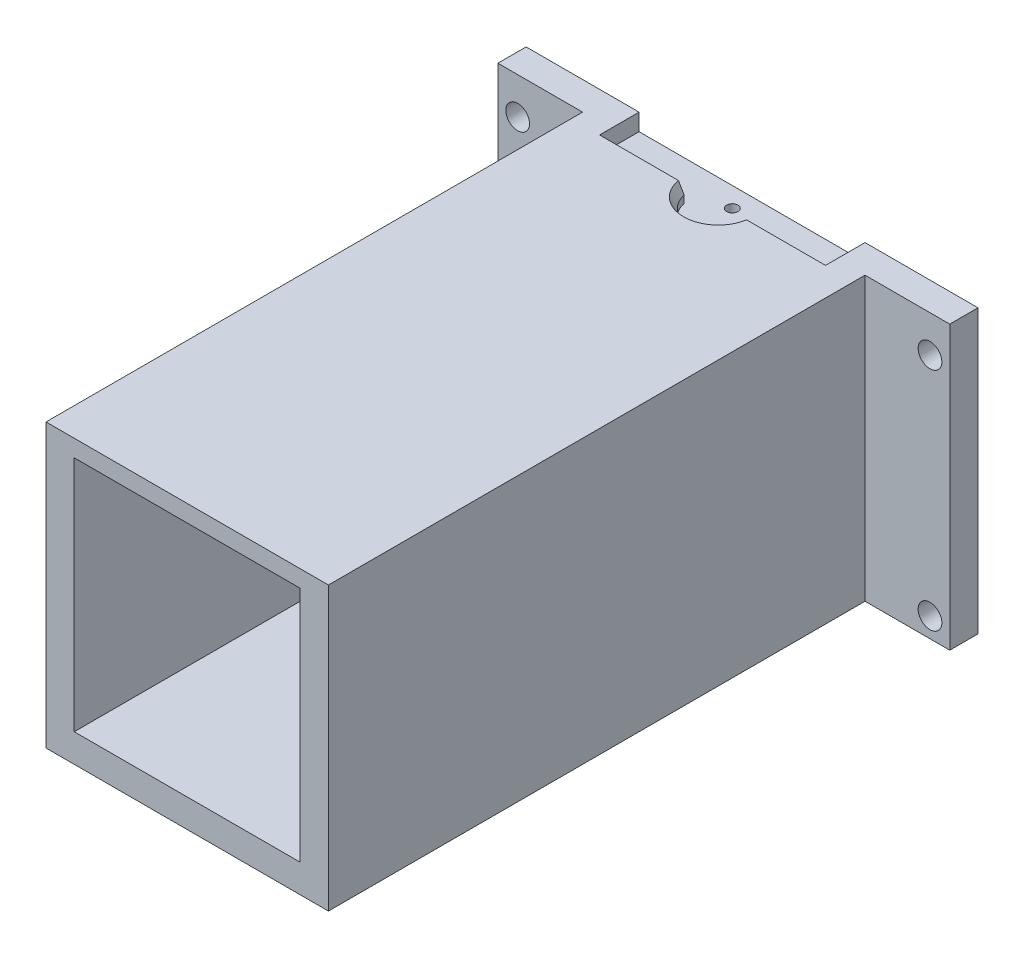
ISO-10303-21;
HEADER;
FILE_DESCRIPTION(('STEP AP214'),'2;1');
FILE_NAME('part.step','',(''),(''),'','','');
FILE_SCHEMA(('AUTOMOTIVE_DESIGN { 1 0 10303 214 1 1 1 1 }'));
ENDSEC;
DATA;
#1=APPLICATION_CONTEXT('core data for automotive mechanical design processes');
#2=APPLICATION_PROTOCOL_DEFINITION('international standard','automotive_design',2000,#1);
#3=PRODUCT_CONTEXT('',#1,'mechanical');
#4=PRODUCT('Part','Part','',(#3));
#5=PRODUCT_RELATED_PRODUCT_CATEGORY('part','',(#4));
#6=PRODUCT_DEFINITION_FORMATION('','',#4);
#7=PRODUCT_DEFINITION_CONTEXT('part definition',#1,'design');
#8=PRODUCT_DEFINITION('design','',#6,#7);
#9=PRODUCT_DEFINITION_SHAPE('','',#8);
#10=(LENGTH_UNIT() NAMED_UNIT(*) SI_UNIT(.MILLI.,.METRE.));
#11=(NAMED_UNIT(*) PLANE_ANGLE_UNIT() SI_UNIT($,.RADIAN.));
#12=(NAMED_UNIT(*) SI_UNIT($,.STERADIAN.) SOLID_ANGLE_UNIT());
#13=UNCERTAINTY_MEASURE_WITH_UNIT(LENGTH_MEASURE(1.E-05),#10,'distance_accuracy_value','');
#14=(GEOMETRIC_REPRESENTATION_CONTEXT(3) GLOBAL_UNCERTAINTY_ASSIGNED_CONTEXT((#13)) GLOBAL_UNIT_ASSIGNED_CONTEXT((#10,
#11,#12)) REPRESENTATION_CONTEXT('',''));
#15=CARTESIAN_POINT('',(0.,0.,0.));
#16=DIRECTION('',(0.,0.,1.));
#17=DIRECTION('',(1.,0.,0.));
#18=AXIS2_PLACEMENT_3D('',#15,#16,#17);
#19=CARTESIAN_POINT('',(60.,50.,7.));
#20=DIRECTION('',(0.,0.,-1.));
#21=DIRECTION('',(-1.,0.,0.));
#22=AXIS2_PLACEMENT_3D('',#19,#20,#21);
#23=PLANE('',#22);
#24=DIRECTION('',(0.,-1.,0.));
#25=VECTOR('',#24,1.);
#26=CARTESIAN_POINT('',(45.0126435336836,50.,7.));
#27=LINE('',#26,#25);
#28=CARTESIAN_POINT('',(45.0126435336836,47.,7.));
#29=VERTEX_POINT('',#28);
#30=CARTESIAN_POINT('',(45.0126435336836,48.2679491924311,7.));
#31=VERTEX_POINT('',#30);
#32=EDGE_CURVE('E192',#29,#31,#27,.F.);
#33=ORIENTED_EDGE('',*,*,#32,.T.);
#34=CARTESIAN_POINT('',(45.0126435336836,48.2679491924311,7.));
#35=CARTESIAN_POINT('',(45.0975478105922,48.4121670716666,7.));
#36=CARTESIAN_POINT('',(45.1823917961742,48.5564204298606,7.));
#37=CARTESIAN_POINT('',(45.3519735955244,48.8449894614087,7.));
#38=CARTESIAN_POINT('',(45.4367114093369,48.989305134737,7.));
#39=CARTESIAN_POINT('',(45.6060953378692,49.2779902589129,7.));
#40=CARTESIAN_POINT('',(45.6907414525984,49.422359709755,7.));
#41=CARTESIAN_POINT('',(45.8599529931935,49.7111459721499,7.));
#42=CARTESIAN_POINT('',(45.9445184190259,49.8555627837222,7.));
#43=CARTESIAN_POINT('',(46.029048966085,50.,7.));
#44=B_SPLINE_CURVE_WITH_KNOTS('',3,(#34,#35,#36,#37,#38,#39,#40,#41,#42,#43),.UNSPECIFIED.,.F.,
.F.,(4,2,2,2,4),(0.,0.50206350386554,1.00412679915011,1.50619004320692,2.00825349554868),.UNSPECIFIED.);
#45=CARTESIAN_POINT('',(46.029048966085,50.,7.));
#46=VERTEX_POINT('',#45);
#47=EDGE_CURVE('E62',#31,#46,#44,.T.);
#48=ORIENTED_EDGE('',*,*,#47,.T.);
#49=DIRECTION('',(1.,0.,0.));
#50=VECTOR('',#49,1.);
#51=CARTESIAN_POINT('',(60.,50.,7.));
#52=LINE('',#51,#50);
#53=CARTESIAN_POINT('',(60.,50.,7.));
#54=VERTEX_POINT('',#53);
#55=EDGE_CURVE('E345',#46,#54,#52,.T.);
#56=ORIENTED_EDGE('',*,*,#55,.T.);
#57=DIRECTION('',(0.,-1.,0.));
#58=VECTOR('',#57,1.);
#59=CARTESIAN_POINT('',(60.,50.,7.));
#60=LINE('',#59,#58);
#61=CARTESIAN_POINT('',(60.,47.,7.));
#62=VERTEX_POINT('',#61);
#63=EDGE_CURVE('E348',#54,#62,#60,.T.);
#64=ORIENTED_EDGE('',*,*,#63,.T.);
#65=DIRECTION('',(1.,0.,0.));
#66=VECTOR('',#65,1.);
#67=CARTESIAN_POINT('',(20.,47.,7.00000000000001));
#68=LINE('',#67,#66);
#69=EDGE_CURVE('E206',#29,#62,#68,.T.);
#70=ORIENTED_EDGE('',*,*,#69,.F.);
#71=EDGE_LOOP('',(#33,#48,#56,#64,#70));
#72=FACE_BOUND('',#71,.T.);
#73=ADVANCED_FACE('F35',(#72),#23,.T.);
#74=CARTESIAN_POINT('',(20.,50.,7.00000000000001));
#75=VERTEX_POINT('',#74);
#76=CARTESIAN_POINT('',(33.970951033915,50.,7.));
#77=VERTEX_POINT('',#76);
#78=EDGE_CURVE('E346',#75,#77,#52,.T.);
#79=ORIENTED_EDGE('',*,*,#78,.T.);
#80=CARTESIAN_POINT('',(33.970951033915,50.,7.));
#81=CARTESIAN_POINT('',(34.0554815809741,49.8555627837222,7.));
#82=CARTESIAN_POINT('',(34.1400470068065,49.7111459721499,7.));
#83=CARTESIAN_POINT('',(34.3092585474016,49.422359709755,7.));
#84=CARTESIAN_POINT('',(34.3939046621308,49.2779902589129,7.));
#85=CARTESIAN_POINT('',(34.5632885906631,48.989305134737,7.));
#86=CARTESIAN_POINT('',(34.6480264044756,48.8449894614088,7.));
#87=CARTESIAN_POINT('',(34.8176082038258,48.5564204298606,7.));
#88=CARTESIAN_POINT('',(34.9024521894077,48.4121670716666,7.));
#89=CARTESIAN_POINT('',(34.9873564663164,48.2679491924311,7.));
#90=B_SPLINE_CURVE_WITH_KNOTS('',3,(#80,#81,#82,#83,#84,#85,#86,#87,#88,#89),.UNSPECIFIED.,.F.,
.F.,(4,2,2,2,4),(0.,0.502063452341765,1.00412669639858,1.50618999168314,2.00825349554869),.UNSPECIFIED.);
#91=CARTESIAN_POINT('',(34.9873564663164,48.2679491924311,7.));
#92=VERTEX_POINT('',#91);
#93=EDGE_CURVE('E11',#77,#92,#90,.T.);
#94=ORIENTED_EDGE('',*,*,#93,.T.);
#95=DIRECTION('',(0.,-1.,0.));
#96=VECTOR('',#95,1.);
#97=CARTESIAN_POINT('',(34.9873564663164,50.,7.));
#98=LINE('',#97,#96);
#99=CARTESIAN_POINT('',(34.9873564663164,47.,7.));
#100=VERTEX_POINT('',#99);
#101=EDGE_CURVE('E181',#92,#100,#98,.T.);
#102=ORIENTED_EDGE('',*,*,#101,.T.);
#103=CARTESIAN_POINT('',(20.,47.,7.00000000000001));
#104=VERTEX_POINT('',#103);
#105=EDGE_CURVE('E186',#104,#100,#68,.T.);
#106=ORIENTED_EDGE('',*,*,#105,.F.);
#107=DIRECTION('',(0.,-1.,0.));
#108=VECTOR('',#107,1.);
#109=CARTESIAN_POINT('',(20.,50.,7.00000000000001));
#110=LINE('',#109,#108);
#111=EDGE_CURVE('E351',#75,#104,#110,.T.);
#112=ORIENTED_EDGE('',*,*,#111,.F.);
#113=EDGE_LOOP('',(#79,#94,#102,#106,#112));
#114=FACE_BOUND('',#113,.T.);
#115=ADVANCED_FACE('F183',(#114),#23,.T.);
#116=CARTESIAN_POINT('',(20.,47.,100.));
#117=DIRECTION('',(0.,-1.,0.));
#118=DIRECTION('',(0.,0.,-1.));
#119=AXIS2_PLACEMENT_3D('',#116,#117,#118);
#120=PLANE('',#119);
#121=DIRECTION('',(0.,0.,-1.));
#122=VECTOR('',#121,1.);
#123=CARTESIAN_POINT('',(20.,47.,100.));
#124=LINE('',#123,#122);
#125=CARTESIAN_POINT('',(20.,47.,100.));
#126=VERTEX_POINT('',#125);
#127=CARTESIAN_POINT('',(20.,47.,14.9301270189221));
#128=VERTEX_POINT('',#127);
#129=EDGE_CURVE('E377',#126,#128,#124,.T.);
#130=ORIENTED_EDGE('',*,*,#129,.T.);
#131=DIRECTION('',(-1.,0.,0.));
#132=VECTOR('',#131,1.);
#133=CARTESIAN_POINT('',(15.,47.,14.9301270189221));
#134=LINE('',#133,#132);
#135=CARTESIAN_POINT('',(60.,47.,14.9301270189221));
#136=VERTEX_POINT('',#135);
#137=EDGE_CURVE('E221',#128,#136,#134,.F.);
#138=ORIENTED_EDGE('',*,*,#137,.T.);
#139=DIRECTION('',(0.,0.,-1.));
#140=VECTOR('',#139,1.);
#141=CARTESIAN_POINT('',(60.,47.,100.));
#142=LINE('',#141,#140);
#143=CARTESIAN_POINT('',(60.,47.,100.));
#144=VERTEX_POINT('',#143);
#145=EDGE_CURVE('E388',#144,#136,#142,.T.);
#146=ORIENTED_EDGE('',*,*,#145,.F.);
#147=DIRECTION('',(-1.,0.,0.));
#148=VECTOR('',#147,1.);
#149=CARTESIAN_POINT('',(20.,47.,100.));
#150=LINE('',#149,#148);
#151=EDGE_CURVE('E375',#144,#126,#150,.T.);
#152=ORIENTED_EDGE('',*,*,#151,.T.);
#153=EDGE_LOOP('',(#130,#138,#146,#152));
#154=FACE_BOUND('',#153,.T.);
#155=ADVANCED_FACE('F258',(#154),#120,.T.);
#156=CARTESIAN_POINT('',(20.,5.,100.));
#157=DIRECTION('',(1.,0.,0.));
#158=DIRECTION('',(0.,0.,-1.));
#159=AXIS2_PLACEMENT_3D('',#156,#157,#158);
#160=PLANE('',#159);
#161=DIRECTION('',(0.,0.,1.));
#162=VECTOR('',#161,1.);
#163=CARTESIAN_POINT('',(20.,44.5,100.));
#164=LINE('',#163,#162);
#165=CARTESIAN_POINT('',(20.,44.5,0.));
#166=VERTEX_POINT('',#165);
#167=CARTESIAN_POINT('',(20.,44.5,10.6));
#168=VERTEX_POINT('',#167);
#169=EDGE_CURVE('E331',#166,#168,#164,.T.);
#170=ORIENTED_EDGE('',*,*,#169,.T.);
#171=DIRECTION('',(0.,-0.500000000000005,-0.866025403784436));
#172=VECTOR('',#171,1.);
#173=CARTESIAN_POINT('',(20.,47.0403411844344,15.));
#174=LINE('',#173,#172);
#175=EDGE_CURVE('E226',#168,#128,#174,.F.);
#176=ORIENTED_EDGE('',*,*,#175,.T.);
#177=ORIENTED_EDGE('',*,*,#129,.F.);
#178=DIRECTION('',(0.,-1.,0.));
#179=VECTOR('',#178,1.);
#180=CARTESIAN_POINT('',(20.,5.,100.));
#181=LINE('',#180,#179);
#182=CARTESIAN_POINT('',(20.,5.,100.));
#183=VERTEX_POINT('',#182);
#184=EDGE_CURVE('E367',#126,#183,#181,.T.);
#185=ORIENTED_EDGE('',*,*,#184,.T.);
#186=DIRECTION('',(0.,0.,-1.));
#187=VECTOR('',#186,1.);
#188=CARTESIAN_POINT('',(20.,5.,100.));
#189=LINE('',#188,#187);
#190=CARTESIAN_POINT('',(20.,5.,0.));
#191=VERTEX_POINT('',#190);
#192=EDGE_CURVE('E392',#183,#191,#189,.T.);
#193=ORIENTED_EDGE('',*,*,#192,.T.);
#194=DIRECTION('',(0.,-1.,0.));
#195=VECTOR('',#194,1.);
#196=CARTESIAN_POINT('',(20.,5.,0.));
#197=LINE('',#196,#195);
#198=EDGE_CURVE('E334',#166,#191,#197,.T.);
#199=ORIENTED_EDGE('',*,*,#198,.F.);
#200=EDGE_LOOP('',(#170,#176,#177,#185,#193,#199));
#201=FACE_BOUND('',#200,.T.);
#202=ADVANCED_FACE('F261',(#201),#160,.T.);
#203=CARTESIAN_POINT('',(60.,5.,100.));
#204=DIRECTION('',(-1.,0.,0.));
#205=DIRECTION('',(0.,0.,1.));
#206=AXIS2_PLACEMENT_3D('',#203,#204,#205);
#207=PLANE('',#206);
#208=ORIENTED_EDGE('',*,*,#145,.T.);
#209=DIRECTION('',(0.,0.500000000000005,0.866025403784436));
#210=VECTOR('',#209,1.);
#211=CARTESIAN_POINT('',(60.,47.0403411844344,15.));
#212=LINE('',#211,#210);
#213=CARTESIAN_POINT('',(60.,44.5,10.6));
#214=VERTEX_POINT('',#213);
#215=EDGE_CURVE('E224',#136,#214,#212,.F.);
#216=ORIENTED_EDGE('',*,*,#215,.T.);
#217=DIRECTION('',(0.,0.,-1.));
#218=VECTOR('',#217,1.);
#219=CARTESIAN_POINT('',(60.,44.5,100.));
#220=LINE('',#219,#218);
#221=CARTESIAN_POINT('',(60.,44.5,0.));
#222=VERTEX_POINT('',#221);
#223=EDGE_CURVE('E205',#214,#222,#220,.T.);
#224=ORIENTED_EDGE('',*,*,#223,.T.);
#225=DIRECTION('',(0.,1.,0.));
#226=VECTOR('',#225,1.);
#227=CARTESIAN_POINT('',(60.,5.,0.));
#228=LINE('',#227,#226);
#229=CARTESIAN_POINT('',(60.,5.,0.));
#230=VERTEX_POINT('',#229);
#231=EDGE_CURVE('E370',#230,#222,#228,.T.);
#232=ORIENTED_EDGE('',*,*,#231,.F.);
#233=DIRECTION('',(0.,0.,-1.));
#234=VECTOR('',#233,1.);
#235=CARTESIAN_POINT('',(60.,5.,100.));
#236=LINE('',#235,#234);
#237=CARTESIAN_POINT('',(60.,5.,100.));
#238=VERTEX_POINT('',#237);
#239=EDGE_CURVE('E390',#238,#230,#236,.T.);
#240=ORIENTED_EDGE('',*,*,#239,.F.);
#241=DIRECTION('',(0.,1.,0.));
#242=VECTOR('',#241,1.);
#243=CARTESIAN_POINT('',(60.,5.,100.));
#244=LINE('',#243,#242);
#245=EDGE_CURVE('E372',#238,#144,#244,.T.);
#246=ORIENTED_EDGE('',*,*,#245,.T.);
#247=EDGE_LOOP('',(#208,#216,#224,#232,#240,#246));
#248=FACE_BOUND('',#247,.T.);
#249=ADVANCED_FACE('F267',(#248),#207,.T.);
#250=CARTESIAN_POINT('',(0.,0.,0.));
#251=DIRECTION('',(0.,0.,-1.));
#252=DIRECTION('',(-1.,0.,0.));
#253=AXIS2_PLACEMENT_3D('',#250,#251,#252);
#254=PLANE('',#253);
#255=CARTESIAN_POINT('',(20.,50.,0.));
#256=VERTEX_POINT('',#255);
#257=CARTESIAN_POINT('',(20.,47.,0.));
#258=VERTEX_POINT('',#257);
#259=EDGE_CURVE('E378',#256,#258,#197,.T.);
#260=ORIENTED_EDGE('',*,*,#259,.T.);
#261=DIRECTION('',(-1.,0.,0.));
#262=VECTOR('',#261,1.);
#263=CARTESIAN_POINT('',(15.,47.,0.));
#264=LINE('',#263,#262);
#265=CARTESIAN_POINT('',(60.,47.,0.));
#266=VERTEX_POINT('',#265);
#267=EDGE_CURVE('E495',#266,#258,#264,.T.);
#268=ORIENTED_EDGE('',*,*,#267,.F.);
#269=CARTESIAN_POINT('',(60.,50.,0.));
#270=VERTEX_POINT('',#269);
#271=EDGE_CURVE('E384',#266,#270,#228,.T.);
#272=ORIENTED_EDGE('',*,*,#271,.T.);
#273=DIRECTION('',(-1.,0.,0.));
#274=VECTOR('',#273,1.);
#275=CARTESIAN_POINT('',(0.,50.,0.));
#276=LINE('',#275,#274);
#277=CARTESIAN_POINT('',(80.,50.,0.));
#278=VERTEX_POINT('',#277);
#279=EDGE_CURVE('E424',#278,#270,#276,.T.);
#280=ORIENTED_EDGE('',*,*,#279,.F.);
#281=DIRECTION('',(0.,1.,0.));
#282=VECTOR('',#281,1.);
#283=CARTESIAN_POINT('',(80.,0.,0.));
#284=LINE('',#283,#282);
#285=CARTESIAN_POINT('',(80.,0.,0.));
#286=VERTEX_POINT('',#285);
#287=EDGE_CURVE('E439',#286,#278,#284,.T.);
#288=ORIENTED_EDGE('',*,*,#287,.F.);
#289=DIRECTION('',(1.,0.,0.));
#290=VECTOR('',#289,1.);
#291=CARTESIAN_POINT('',(0.,0.,0.));
#292=LINE('',#291,#290);
#293=CARTESIAN_POINT('',(0.,0.,0.));
#294=VERTEX_POINT('',#293);
#295=EDGE_CURVE('E437',#294,#286,#292,.T.);
#296=ORIENTED_EDGE('',*,*,#295,.F.);
#297=DIRECTION('',(0.,-1.,0.));
#298=VECTOR('',#297,1.);
#299=CARTESIAN_POINT('',(0.,0.,0.));
#300=LINE('',#299,#298);
#301=CARTESIAN_POINT('',(0.,50.,0.));
#302=VERTEX_POINT('',#301);
#303=EDGE_CURVE('E419',#302,#294,#300,.T.);
#304=ORIENTED_EDGE('',*,*,#303,.F.);
#305=EDGE_CURVE('E441',#256,#302,#276,.T.);
#306=ORIENTED_EDGE('',*,*,#305,.F.);
#307=EDGE_LOOP('',(#260,#268,#272,#280,#288,#296,#304,#306));
#308=FACE_BOUND('',#307,.T.);
#309=DIRECTION('',(-1.,0.,0.));
#310=VECTOR('',#309,1.);
#311=CARTESIAN_POINT('',(15.,44.5,0.));
#312=LINE('',#311,#310);
#313=EDGE_CURVE('E496',#222,#166,#312,.T.);
#314=ORIENTED_EDGE('',*,*,#313,.T.);
#315=ORIENTED_EDGE('',*,*,#198,.T.);
#316=DIRECTION('',(1.,0.,0.));
#317=VECTOR('',#316,1.);
#318=CARTESIAN_POINT('',(20.,5.,0.));
#319=LINE('',#318,#317);
#320=EDGE_CURVE('E381',#191,#230,#319,.T.);
#321=ORIENTED_EDGE('',*,*,#320,.T.);
#322=ORIENTED_EDGE('',*,*,#231,.T.);
#323=EDGE_LOOP('',(#314,#315,#321,#322));
#324=FACE_BOUND('',#323,.T.);
#325=CARTESIAN_POINT('',(76.5,43.5,0.));
#326=DIRECTION('',(0.,0.,1.));
#327=DIRECTION('',(1.,0.,0.));
#328=AXIS2_PLACEMENT_3D('',#325,#326,#327);
#329=CIRCLE('',#328,2.1);
#330=CARTESIAN_POINT('',(78.6,43.5,0.));
#331=VERTEX_POINT('',#330);
#332=EDGE_CURVE('E354',#331,#331,#329,.T.);
#333=ORIENTED_EDGE('',*,*,#332,.T.);
#334=EDGE_LOOP('',(#333));
#335=FACE_BOUND('',#334,.T.);
#336=CARTESIAN_POINT('',(3.5,3.5,0.));
#337=DIRECTION('',(0.,0.,1.));
#338=DIRECTION('',(1.,0.,0.));
#339=AXIS2_PLACEMENT_3D('',#336,#337,#338);
#340=CIRCLE('',#339,2.1);
#341=CARTESIAN_POINT('',(5.6,3.5,0.));
#342=VERTEX_POINT('',#341);
#343=EDGE_CURVE('E358',#342,#342,#340,.T.);
#344=ORIENTED_EDGE('',*,*,#343,.T.);
#345=EDGE_LOOP('',(#344));
#346=FACE_BOUND('',#345,.T.);
#347=CARTESIAN_POINT('',(3.5,43.5,0.));
#348=DIRECTION('',(0.,0.,1.));
#349=DIRECTION('',(1.,0.,0.));
#350=AXIS2_PLACEMENT_3D('',#347,#348,#349);
#351=CIRCLE('',#350,2.1);
#352=CARTESIAN_POINT('',(5.6,43.5,0.));
#353=VERTEX_POINT('',#352);
#354=EDGE_CURVE('E353',#353,#353,#351,.T.);
#355=ORIENTED_EDGE('',*,*,#354,.T.);
#356=EDGE_LOOP('',(#355));
#357=FACE_BOUND('',#356,.T.);
#358=CARTESIAN_POINT('',(76.5,3.5,0.));
#359=DIRECTION('',(0.,0.,1.));
#360=DIRECTION('',(1.,0.,0.));
#361=AXIS2_PLACEMENT_3D('',#358,#359,#360);
#362=CIRCLE('',#361,2.1);
#363=CARTESIAN_POINT('',(78.6,3.5,0.));
#364=VERTEX_POINT('',#363);
#365=EDGE_CURVE('E363',#364,#364,#362,.T.);
#366=ORIENTED_EDGE('',*,*,#365,.T.);
#367=EDGE_LOOP('',(#366));
#368=FACE_BOUND('',#367,.T.);
#369=ADVANCED_FACE('F294',(#308,#324,#335,#346,#357,#368),#254,.T.);
#370=CARTESIAN_POINT('',(0.,50.,5.));
#371=DIRECTION('',(0.,-1.,0.));
#372=DIRECTION('',(0.,0.,-1.));
#373=AXIS2_PLACEMENT_3D('',#370,#371,#372);
#374=PLANE('',#373);
#375=ORIENTED_EDGE('',*,*,#55,.F.);
#376=CARTESIAN_POINT('',(40.,50.,6.));
#377=DIRECTION('',(0.,-1.,0.));
#378=DIRECTION('',(0.,0.,-1.));
#379=AXIS2_PLACEMENT_3D('',#376,#377,#378);
#380=CIRCLE('',#379,6.11141811983522);
#381=EDGE_CURVE('E48',#46,#77,#380,.T.);
#382=ORIENTED_EDGE('',*,*,#381,.T.);
#383=ORIENTED_EDGE('',*,*,#78,.F.);
#384=DIRECTION('',(0.,0.,1.));
#385=VECTOR('',#384,1.);
#386=CARTESIAN_POINT('',(20.,50.,0.));
#387=LINE('',#386,#385);
#388=EDGE_CURVE('E338',#256,#75,#387,.T.);
#389=ORIENTED_EDGE('',*,*,#388,.F.);
#390=ORIENTED_EDGE('',*,*,#305,.T.);
#391=DIRECTION('',(0.,0.,-1.));
#392=VECTOR('',#391,1.);
#393=CARTESIAN_POINT('',(0.,50.,5.));
#394=LINE('',#393,#392);
#395=CARTESIAN_POINT('',(0.,50.,5.));
#396=VERTEX_POINT('',#395);
#397=EDGE_CURVE('E434',#396,#302,#394,.T.);
#398=ORIENTED_EDGE('',*,*,#397,.F.);
#399=DIRECTION('',(-1.,0.,0.));
#400=VECTOR('',#399,1.);
#401=CARTESIAN_POINT('',(0.,50.,5.));
#402=LINE('',#401,#400);
#403=CARTESIAN_POINT('',(15.,50.,5.));
#404=VERTEX_POINT('',#403);
#405=EDGE_CURVE('E430',#404,#396,#402,.T.);
#406=ORIENTED_EDGE('',*,*,#405,.F.);
#407=DIRECTION('',(0.,0.,-1.));
#408=VECTOR('',#407,1.);
#409=CARTESIAN_POINT('',(15.,50.,100.));
#410=LINE('',#409,#408);
#411=CARTESIAN_POINT('',(15.,50.,100.));
#412=VERTEX_POINT('',#411);
#413=EDGE_CURVE('E403',#412,#404,#410,.T.);
#414=ORIENTED_EDGE('',*,*,#413,.F.);
#415=DIRECTION('',(-1.,0.,0.));
#416=VECTOR('',#415,1.);
#417=CARTESIAN_POINT('',(15.,50.,100.));
#418=LINE('',#417,#416);
#419=CARTESIAN_POINT('',(65.,50.,100.));
#420=VERTEX_POINT('',#419);
#421=EDGE_CURVE('E401',#420,#412,#418,.T.);
#422=ORIENTED_EDGE('',*,*,#421,.F.);
#423=DIRECTION('',(0.,0.,-1.));
#424=VECTOR('',#423,1.);
#425=CARTESIAN_POINT('',(65.,50.,100.));
#426=LINE('',#425,#424);
#427=CARTESIAN_POINT('',(65.,50.,5.));
#428=VERTEX_POINT('',#427);
#429=EDGE_CURVE('E406',#420,#428,#426,.T.);
#430=ORIENTED_EDGE('',*,*,#429,.T.);
#431=CARTESIAN_POINT('',(80.,50.,5.));
#432=VERTEX_POINT('',#431);
#433=EDGE_CURVE('E431',#432,#428,#402,.T.);
#434=ORIENTED_EDGE('',*,*,#433,.F.);
#435=DIRECTION('',(0.,0.,-1.));
#436=VECTOR('',#435,1.);
#437=CARTESIAN_POINT('',(80.,50.,5.));
#438=LINE('',#437,#436);
#439=EDGE_CURVE('E446',#432,#278,#438,.T.);
#440=ORIENTED_EDGE('',*,*,#439,.T.);
#441=ORIENTED_EDGE('',*,*,#279,.T.);
#442=DIRECTION('',(0.,0.,-1.));
#443=VECTOR('',#442,1.);
#444=CARTESIAN_POINT('',(60.,50.,0.));
#445=LINE('',#444,#443);
#446=EDGE_CURVE('E335',#54,#270,#445,.T.);
#447=ORIENTED_EDGE('',*,*,#446,.F.);
#448=EDGE_LOOP('',(#375,#382,#383,#389,#390,#398,#406,#414,#422,#430,#434,#440,#441,#447));
#449=FACE_BOUND('',#448,.T.);
#450=ADVANCED_FACE('F280',(#449),#374,.F.);
#451=CARTESIAN_POINT('',(0.,0.,100.));
#452=DIRECTION('',(0.,0.,-1.));
#453=DIRECTION('',(-1.,0.,0.));
#454=AXIS2_PLACEMENT_3D('',#451,#452,#453);
#455=PLANE('',#454);
#456=DIRECTION('',(0.,-1.,0.));
#457=VECTOR('',#456,1.);
#458=CARTESIAN_POINT('',(15.,0.,100.));
#459=LINE('',#458,#457);
#460=CARTESIAN_POINT('',(15.,0.,100.));
#461=VERTEX_POINT('',#460);
#462=EDGE_CURVE('E394',#412,#461,#459,.T.);
#463=ORIENTED_EDGE('',*,*,#462,.T.);
#464=DIRECTION('',(1.,0.,0.));
#465=VECTOR('',#464,1.);
#466=CARTESIAN_POINT('',(15.,0.,100.));
#467=LINE('',#466,#465);
#468=CARTESIAN_POINT('',(65.,0.,100.));
#469=VERTEX_POINT('',#468);
#470=EDGE_CURVE('E397',#461,#469,#467,.T.);
#471=ORIENTED_EDGE('',*,*,#470,.T.);
#472=DIRECTION('',(0.,1.,0.));
#473=VECTOR('',#472,1.);
#474=CARTESIAN_POINT('',(65.,0.,100.));
#475=LINE('',#474,#473);
#476=EDGE_CURVE('E399',#469,#420,#475,.T.);
#477=ORIENTED_EDGE('',*,*,#476,.T.);
#478=ORIENTED_EDGE('',*,*,#421,.T.);
#479=EDGE_LOOP('',(#463,#471,#477,#478));
#480=FACE_BOUND('',#479,.T.);
#481=ORIENTED_EDGE('',*,*,#184,.F.);
#482=ORIENTED_EDGE('',*,*,#151,.F.);
#483=ORIENTED_EDGE('',*,*,#245,.F.);
#484=DIRECTION('',(1.,0.,0.));
#485=VECTOR('',#484,1.);
#486=CARTESIAN_POINT('',(20.,5.,100.));
#487=LINE('',#486,#485);
#488=EDGE_CURVE('E369',#183,#238,#487,.T.);
#489=ORIENTED_EDGE('',*,*,#488,.F.);
#490=EDGE_LOOP('',(#481,#482,#483,#489));
#491=FACE_BOUND('',#490,.T.);
#492=ADVANCED_FACE('F276',(#480,#491),#455,.F.);
#493=CARTESIAN_POINT('',(0.,0.,5.));
#494=DIRECTION('',(0.,0.,-1.));
#495=DIRECTION('',(-1.,0.,0.));
#496=AXIS2_PLACEMENT_3D('',#493,#494,#495);
#497=PLANE('',#496);
#498=CARTESIAN_POINT('',(3.5,3.5,5.));
#499=DIRECTION('',(0.,0.,-1.));
#500=DIRECTION('',(-1.,0.,0.));
#501=AXIS2_PLACEMENT_3D('',#498,#499,#500);
#502=CIRCLE('',#501,2.1);
#503=CARTESIAN_POINT('',(1.4,3.5,5.));
#504=VERTEX_POINT('',#503);
#505=EDGE_CURVE('E212',#504,#504,#502,.F.);
#506=ORIENTED_EDGE('',*,*,#505,.F.);
#507=EDGE_LOOP('',(#506));
#508=FACE_BOUND('',#507,.T.);
#509=CARTESIAN_POINT('',(3.5,43.5,5.));
#510=DIRECTION('',(0.,0.,-1.));
#511=DIRECTION('',(-1.,0.,0.));
#512=AXIS2_PLACEMENT_3D('',#509,#510,#511);
#513=CIRCLE('',#512,2.1);
#514=CARTESIAN_POINT('',(1.4,43.5,5.));
#515=VERTEX_POINT('',#514);
#516=EDGE_CURVE('E457',#515,#515,#513,.F.);
#517=ORIENTED_EDGE('',*,*,#516,.F.);
#518=EDGE_LOOP('',(#517));
#519=FACE_BOUND('',#518,.T.);
#520=DIRECTION('',(0.,-1.,0.));
#521=VECTOR('',#520,1.);
#522=CARTESIAN_POINT('',(15.,0.,5.));
#523=LINE('',#522,#521);
#524=CARTESIAN_POINT('',(15.,0.,5.));
#525=VERTEX_POINT('',#524);
#526=EDGE_CURVE('E417',#404,#525,#523,.T.);
#527=ORIENTED_EDGE('',*,*,#526,.F.);
#528=ORIENTED_EDGE('',*,*,#405,.T.);
#529=DIRECTION('',(0.,-1.,0.));
#530=VECTOR('',#529,1.);
#531=CARTESIAN_POINT('',(0.,0.,5.));
#532=LINE('',#531,#530);
#533=CARTESIAN_POINT('',(0.,0.,5.));
#534=VERTEX_POINT('',#533);
#535=EDGE_CURVE('E420',#396,#534,#532,.T.);
#536=ORIENTED_EDGE('',*,*,#535,.T.);
#537=DIRECTION('',(1.,0.,0.));
#538=VECTOR('',#537,1.);
#539=CARTESIAN_POINT('',(0.,0.,5.));
#540=LINE('',#539,#538);
#541=EDGE_CURVE('E425',#534,#525,#540,.T.);
#542=ORIENTED_EDGE('',*,*,#541,.T.);
#543=EDGE_LOOP('',(#527,#528,#536,#542));
#544=FACE_BOUND('',#543,.T.);
#545=ADVANCED_FACE('F279',(#508,#519,#544),#497,.F.);
#546=CARTESIAN_POINT('',(76.5,43.5,5.));
#547=DIRECTION('',(0.,0.,-1.));
#548=DIRECTION('',(-1.,0.,0.));
#549=AXIS2_PLACEMENT_3D('',#546,#547,#548);
#550=CIRCLE('',#549,2.1);
#551=CARTESIAN_POINT('',(74.4,43.5,5.));
#552=VERTEX_POINT('',#551);
#553=EDGE_CURVE('E357',#552,#552,#550,.F.);
#554=ORIENTED_EDGE('',*,*,#553,.F.);
#555=EDGE_LOOP('',(#554));
#556=FACE_BOUND('',#555,.T.);
#557=CARTESIAN_POINT('',(76.5,3.5,5.));
#558=DIRECTION('',(0.,0.,-1.));
#559=DIRECTION('',(-1.,0.,0.));
#560=AXIS2_PLACEMENT_3D('',#557,#558,#559);
#561=CIRCLE('',#560,2.1);
#562=CARTESIAN_POINT('',(74.4,3.5,5.));
#563=VERTEX_POINT('',#562);
#564=EDGE_CURVE('E366',#563,#563,#561,.F.);
#565=ORIENTED_EDGE('',*,*,#564,.F.);
#566=EDGE_LOOP('',(#565));
#567=FACE_BOUND('',#566,.T.);
#568=DIRECTION('',(0.,1.,0.));
#569=VECTOR('',#568,1.);
#570=CARTESIAN_POINT('',(65.,0.,5.));
#571=LINE('',#570,#569);
#572=CARTESIAN_POINT('',(65.,0.,5.));
#573=VERTEX_POINT('',#572);
#574=EDGE_CURVE('E415',#573,#428,#571,.T.);
#575=ORIENTED_EDGE('',*,*,#574,.F.);
#576=CARTESIAN_POINT('',(80.,0.,5.));
#577=VERTEX_POINT('',#576);
#578=EDGE_CURVE('E423',#573,#577,#540,.T.);
#579=ORIENTED_EDGE('',*,*,#578,.T.);
#580=DIRECTION('',(0.,1.,0.));
#581=VECTOR('',#580,1.);
#582=CARTESIAN_POINT('',(80.,0.,5.));
#583=LINE('',#582,#581);
#584=EDGE_CURVE('E428',#577,#432,#583,.T.);
#585=ORIENTED_EDGE('',*,*,#584,.T.);
#586=ORIENTED_EDGE('',*,*,#433,.T.);
#587=EDGE_LOOP('',(#575,#579,#585,#586));
#588=FACE_BOUND('',#587,.T.);
#589=ADVANCED_FACE('F292',(#556,#567,#588),#497,.F.);
#590=CARTESIAN_POINT('',(0.,0.,5.));
#591=DIRECTION('',(1.,0.,0.));
#592=DIRECTION('',(0.,0.,-1.));
#593=AXIS2_PLACEMENT_3D('',#590,#591,#592);
#594=PLANE('',#593);
#595=ORIENTED_EDGE('',*,*,#303,.T.);
#596=DIRECTION('',(0.,0.,-1.));
#597=VECTOR('',#596,1.);
#598=CARTESIAN_POINT('',(0.,0.,5.));
#599=LINE('',#598,#597);
#600=EDGE_CURVE('E210',#534,#294,#599,.T.);
#601=ORIENTED_EDGE('',*,*,#600,.F.);
#602=ORIENTED_EDGE('',*,*,#535,.F.);
#603=ORIENTED_EDGE('',*,*,#397,.T.);
#604=EDGE_LOOP('',(#595,#601,#602,#603));
#605=FACE_BOUND('',#604,.T.);
#606=ADVANCED_FACE('F306',(#605),#594,.F.);
#607=CARTESIAN_POINT('',(0.,0.,5.));
#608=DIRECTION('',(0.,1.,0.));
#609=DIRECTION('',(0.,0.,1.));
#610=AXIS2_PLACEMENT_3D('',#607,#608,#609);
#611=PLANE('',#610);
#612=ORIENTED_EDGE('',*,*,#295,.T.);
#613=DIRECTION('',(0.,0.,-1.));
#614=VECTOR('',#613,1.);
#615=CARTESIAN_POINT('',(80.,0.,5.));
#616=LINE('',#615,#614);
#617=EDGE_CURVE('E449',#577,#286,#616,.T.);
#618=ORIENTED_EDGE('',*,*,#617,.F.);
#619=ORIENTED_EDGE('',*,*,#578,.F.);
#620=DIRECTION('',(0.,0.,-1.));
#621=VECTOR('',#620,1.);
#622=CARTESIAN_POINT('',(65.,0.,100.));
#623=LINE('',#622,#621);
#624=EDGE_CURVE('E409',#469,#573,#623,.T.);
#625=ORIENTED_EDGE('',*,*,#624,.F.);
#626=ORIENTED_EDGE('',*,*,#470,.F.);
#627=DIRECTION('',(0.,0.,-1.));
#628=VECTOR('',#627,1.);
#629=CARTESIAN_POINT('',(15.,0.,100.));
#630=LINE('',#629,#628);
#631=EDGE_CURVE('E412',#461,#525,#630,.T.);
#632=ORIENTED_EDGE('',*,*,#631,.T.);
#633=ORIENTED_EDGE('',*,*,#541,.F.);
#634=ORIENTED_EDGE('',*,*,#600,.T.);
#635=EDGE_LOOP('',(#612,#618,#619,#625,#626,#632,#633,#634));
#636=FACE_BOUND('',#635,.T.);
#637=ADVANCED_FACE('F302',(#636),#611,.F.);
#638=CARTESIAN_POINT('',(80.,0.,5.));
#639=DIRECTION('',(-1.,0.,0.));
#640=DIRECTION('',(0.,0.,1.));
#641=AXIS2_PLACEMENT_3D('',#638,#639,#640);
#642=PLANE('',#641);
#643=ORIENTED_EDGE('',*,*,#287,.T.);
#644=ORIENTED_EDGE('',*,*,#439,.F.);
#645=ORIENTED_EDGE('',*,*,#584,.F.);
#646=ORIENTED_EDGE('',*,*,#617,.T.);
#647=EDGE_LOOP('',(#643,#644,#645,#646));
#648=FACE_BOUND('',#647,.T.);
#649=ADVANCED_FACE('F288',(#648),#642,.F.);
#650=CARTESIAN_POINT('',(15.,0.,100.));
#651=DIRECTION('',(1.,0.,0.));
#652=DIRECTION('',(0.,0.,-1.));
#653=AXIS2_PLACEMENT_3D('',#650,#651,#652);
#654=PLANE('',#653);
#655=ORIENTED_EDGE('',*,*,#526,.T.);
#656=ORIENTED_EDGE('',*,*,#631,.F.);
#657=ORIENTED_EDGE('',*,*,#462,.F.);
#658=ORIENTED_EDGE('',*,*,#413,.T.);
#659=EDGE_LOOP('',(#655,#656,#657,#658));
#660=FACE_BOUND('',#659,.T.);
#661=ADVANCED_FACE('F284',(#660),#654,.F.);
#662=CARTESIAN_POINT('',(65.,0.,100.));
#663=DIRECTION('',(-1.,0.,0.));
#664=DIRECTION('',(0.,0.,1.));
#665=AXIS2_PLACEMENT_3D('',#662,#663,#664);
#666=PLANE('',#665);
#667=ORIENTED_EDGE('',*,*,#574,.T.);
#668=ORIENTED_EDGE('',*,*,#429,.F.);
#669=ORIENTED_EDGE('',*,*,#476,.F.);
#670=ORIENTED_EDGE('',*,*,#624,.T.);
#671=EDGE_LOOP('',(#667,#668,#669,#670));
#672=FACE_BOUND('',#671,.T.);
#673=ADVANCED_FACE('F274',(#672),#666,.F.);
#674=DIRECTION('',(0.,0.,1.));
#675=VECTOR('',#674,1.);
#676=CARTESIAN_POINT('',(20.,47.,100.));
#677=LINE('',#676,#675);
#678=EDGE_CURVE('E204',#258,#104,#677,.T.);
#679=ORIENTED_EDGE('',*,*,#678,.F.);
#680=ORIENTED_EDGE('',*,*,#259,.F.);
#681=ORIENTED_EDGE('',*,*,#388,.T.);
#682=ORIENTED_EDGE('',*,*,#111,.T.);
#683=EDGE_LOOP('',(#679,#680,#681,#682));
#684=FACE_BOUND('',#683,.T.);
#685=ADVANCED_FACE('F270',(#684),#160,.T.);
#686=CARTESIAN_POINT('',(20.,5.,100.));
#687=DIRECTION('',(0.,1.,0.));
#688=DIRECTION('',(0.,0.,1.));
#689=AXIS2_PLACEMENT_3D('',#686,#687,#688);
#690=PLANE('',#689);
#691=ORIENTED_EDGE('',*,*,#320,.F.);
#692=ORIENTED_EDGE('',*,*,#192,.F.);
#693=ORIENTED_EDGE('',*,*,#488,.T.);
#694=ORIENTED_EDGE('',*,*,#239,.T.);
#695=EDGE_LOOP('',(#691,#692,#693,#694));
#696=FACE_BOUND('',#695,.T.);
#697=ADVANCED_FACE('F265',(#696),#690,.T.);
#698=DIRECTION('',(0.,0.,-1.));
#699=VECTOR('',#698,1.);
#700=CARTESIAN_POINT('',(60.,47.,100.));
#701=LINE('',#700,#699);
#702=EDGE_CURVE('E340',#62,#266,#701,.T.);
#703=ORIENTED_EDGE('',*,*,#702,.F.);
#704=ORIENTED_EDGE('',*,*,#63,.F.);
#705=ORIENTED_EDGE('',*,*,#446,.T.);
#706=ORIENTED_EDGE('',*,*,#271,.F.);
#707=EDGE_LOOP('',(#703,#704,#705,#706));
#708=FACE_BOUND('',#707,.T.);
#709=ADVANCED_FACE('F256',(#708),#207,.T.);
#710=CARTESIAN_POINT('',(76.5,3.5,10.));
#711=DIRECTION('',(0.,0.,-1.));
#712=DIRECTION('',(-1.,0.,0.));
#713=AXIS2_PLACEMENT_3D('',#710,#711,#712);
#714=CYLINDRICAL_SURFACE('',#713,2.1);
#715=ORIENTED_EDGE('',*,*,#365,.F.);
#716=EDGE_LOOP('',(#715));
#717=FACE_BOUND('',#716,.T.);
#718=ORIENTED_EDGE('',*,*,#564,.T.);
#719=EDGE_LOOP('',(#718));
#720=FACE_BOUND('',#719,.T.);
#721=ADVANCED_FACE('F245',(#717,#720),#714,.F.);
#722=CARTESIAN_POINT('',(76.5,43.5,10.));
#723=DIRECTION('',(0.,0.,-1.));
#724=DIRECTION('',(-1.,0.,0.));
#725=AXIS2_PLACEMENT_3D('',#722,#723,#724);
#726=CYLINDRICAL_SURFACE('',#725,2.1);
#727=ORIENTED_EDGE('',*,*,#332,.F.);
#728=EDGE_LOOP('',(#727));
#729=FACE_BOUND('',#728,.T.);
#730=ORIENTED_EDGE('',*,*,#553,.T.);
#731=EDGE_LOOP('',(#730));
#732=FACE_BOUND('',#731,.T.);
#733=ADVANCED_FACE('F240',(#729,#732),#726,.F.);
#734=CARTESIAN_POINT('',(3.5,43.5,10.));
#735=DIRECTION('',(0.,0.,-1.));
#736=DIRECTION('',(-1.,0.,0.));
#737=AXIS2_PLACEMENT_3D('',#734,#735,#736);
#738=CYLINDRICAL_SURFACE('',#737,2.1);
#739=ORIENTED_EDGE('',*,*,#354,.F.);
#740=EDGE_LOOP('',(#739));
#741=FACE_BOUND('',#740,.T.);
#742=ORIENTED_EDGE('',*,*,#516,.T.);
#743=EDGE_LOOP('',(#742));
#744=FACE_BOUND('',#743,.T.);
#745=ADVANCED_FACE('F244',(#741,#744),#738,.F.);
#746=CARTESIAN_POINT('',(3.5,3.5,10.));
#747=DIRECTION('',(0.,0.,-1.));
#748=DIRECTION('',(-1.,0.,0.));
#749=AXIS2_PLACEMENT_3D('',#746,#747,#748);
#750=CYLINDRICAL_SURFACE('',#749,2.1);
#751=ORIENTED_EDGE('',*,*,#343,.F.);
#752=EDGE_LOOP('',(#751));
#753=FACE_BOUND('',#752,.T.);
#754=ORIENTED_EDGE('',*,*,#505,.T.);
#755=EDGE_LOOP('',(#754));
#756=FACE_BOUND('',#755,.T.);
#757=ADVANCED_FACE('F247',(#753,#756),#750,.F.);
#758=CARTESIAN_POINT('',(0.,47.,0.));
#759=DIRECTION('',(0.,1.,0.));
#760=DIRECTION('',(0.,0.,1.));
#761=AXIS2_PLACEMENT_3D('',#758,#759,#760);
#762=PLANE('',#761);
#763=ORIENTED_EDGE('',*,*,#105,.T.);
#764=CARTESIAN_POINT('',(40.,47.,6.));
#765=DIRECTION('',(0.,1.,0.));
#766=DIRECTION('',(0.,0.,1.));
#767=AXIS2_PLACEMENT_3D('',#764,#765,#766);
#768=CIRCLE('',#767,5.11141811983521);
#769=EDGE_CURVE('E193',#100,#29,#768,.T.);
#770=ORIENTED_EDGE('',*,*,#769,.T.);
#771=ORIENTED_EDGE('',*,*,#69,.T.);
#772=ORIENTED_EDGE('',*,*,#702,.T.);
#773=ORIENTED_EDGE('',*,*,#267,.T.);
#774=ORIENTED_EDGE('',*,*,#678,.T.);
#775=EDGE_LOOP('',(#763,#770,#771,#772,#773,#774));
#776=FACE_BOUND('',#775,.T.);
#777=CARTESIAN_POINT('',(40.,47.,3.5));
#778=DIRECTION('',(0.,1.,0.));
#779=DIRECTION('',(0.,0.,1.));
#780=AXIS2_PLACEMENT_3D('',#777,#778,#779);
#781=CIRCLE('',#780,0.999999999999998);
#782=CARTESIAN_POINT('',(40.,47.,4.5));
#783=VERTEX_POINT('',#782);
#784=EDGE_CURVE('E218',#783,#783,#781,.F.);
#785=ORIENTED_EDGE('',*,*,#784,.T.);
#786=EDGE_LOOP('',(#785));
#787=FACE_BOUND('',#786,.T.);
#788=ADVANCED_FACE('F201',(#776,#787),#762,.T.);
#789=CARTESIAN_POINT('',(0.,44.5,0.));
#790=DIRECTION('',(0.,1.,0.));
#791=DIRECTION('',(0.,0.,1.));
#792=AXIS2_PLACEMENT_3D('',#789,#790,#791);
#793=PLANE('',#792);
#794=CARTESIAN_POINT('',(40.,44.5,3.5));
#795=DIRECTION('',(0.,1.,0.));
#796=DIRECTION('',(0.,0.,1.));
#797=AXIS2_PLACEMENT_3D('',#794,#795,#796);
#798=CIRCLE('',#797,0.999999999999998);
#799=CARTESIAN_POINT('',(40.,44.5,4.5));
#800=VERTEX_POINT('',#799);
#801=EDGE_CURVE('E215',#800,#800,#798,.F.);
#802=ORIENTED_EDGE('',*,*,#801,.F.);
#803=EDGE_LOOP('',(#802));
#804=FACE_BOUND('',#803,.T.);
#805=ORIENTED_EDGE('',*,*,#223,.F.);
#806=DIRECTION('',(-1.,0.,0.));
#807=VECTOR('',#806,1.);
#808=CARTESIAN_POINT('',(0.,44.5,10.6));
#809=LINE('',#808,#807);
#810=EDGE_CURVE('E208',#214,#168,#809,.T.);
#811=ORIENTED_EDGE('',*,*,#810,.T.);
#812=ORIENTED_EDGE('',*,*,#169,.F.);
#813=ORIENTED_EDGE('',*,*,#313,.F.);
#814=EDGE_LOOP('',(#805,#811,#812,#813));
#815=FACE_BOUND('',#814,.T.);
#816=ADVANCED_FACE('F238',(#804,#815),#793,.F.);
#817=CARTESIAN_POINT('',(40.,50.,3.5));
#818=DIRECTION('',(0.,-1.,0.));
#819=DIRECTION('',(0.,0.,-1.));
#820=AXIS2_PLACEMENT_3D('',#817,#818,#819);
#821=CYLINDRICAL_SURFACE('',#820,0.999999999999998);
#822=ORIENTED_EDGE('',*,*,#784,.F.);
#823=EDGE_LOOP('',(#822));
#824=FACE_BOUND('',#823,.T.);
#825=ORIENTED_EDGE('',*,*,#801,.T.);
#826=EDGE_LOOP('',(#825));
#827=FACE_BOUND('',#826,.T.);
#828=ADVANCED_FACE('F312',(#824,#827),#821,.F.);
#829=CARTESIAN_POINT('',(15.,47.0403411844344,15.));
#830=DIRECTION('',(0.,0.866025403784436,-0.500000000000005));
#831=DIRECTION('',(1.,0.,0.));
#832=AXIS2_PLACEMENT_3D('',#829,#830,#831);
#833=PLANE('',#832);
#834=ORIENTED_EDGE('',*,*,#175,.F.);
#835=ORIENTED_EDGE('',*,*,#810,.F.);
#836=ORIENTED_EDGE('',*,*,#215,.F.);
#837=ORIENTED_EDGE('',*,*,#137,.F.);
#838=EDGE_LOOP('',(#834,#835,#836,#837));
#839=FACE_BOUND('',#838,.T.);
#840=ADVANCED_FACE('F310',(#839),#833,.F.);
#841=CARTESIAN_POINT('',(40.,50.,6.));
#842=DIRECTION('',(0.,-1.,0.));
#843=DIRECTION('',(0.,0.,-1.));
#844=AXIS2_PLACEMENT_3D('',#841,#842,#843);
#845=CYLINDRICAL_SURFACE('',#844,5.11141811983521);
#846=ORIENTED_EDGE('',*,*,#101,.F.);
#847=CARTESIAN_POINT('',(40.,48.2679491924311,6.));
#848=DIRECTION('',(0.,-1.,0.));
#849=DIRECTION('',(0.,0.,-1.));
#850=AXIS2_PLACEMENT_3D('',#847,#848,#849);
#851=CIRCLE('',#850,5.11141811983521);
#852=EDGE_CURVE('E229',#92,#31,#851,.F.);
#853=ORIENTED_EDGE('',*,*,#852,.T.);
#854=ORIENTED_EDGE('',*,*,#32,.F.);
#855=ORIENTED_EDGE('',*,*,#769,.F.);
#856=EDGE_LOOP('',(#846,#853,#854,#855));
#857=FACE_BOUND('',#856,.T.);
#858=ADVANCED_FACE('F196',(#857),#845,.F.);
#859=CARTESIAN_POINT('',(40.,48.2679491924311,6.));
#860=DIRECTION('',(0.,1.,0.));
#861=DIRECTION('',(0.,0.,1.));
#862=AXIS2_PLACEMENT_3D('',#859,#860,#861);
#863=CONICAL_SURFACE('',#862,5.11141811983521,0.523598775598302);
#864=ORIENTED_EDGE('',*,*,#93,.F.);
#865=ORIENTED_EDGE('',*,*,#381,.F.);
#866=ORIENTED_EDGE('',*,*,#47,.F.);
#867=ORIENTED_EDGE('',*,*,#852,.F.);
#868=EDGE_LOOP('',(#864,#865,#866,#867));
#869=FACE_BOUND('',#868,.T.);
#870=ADVANCED_FACE('F37',(#869),#863,.F.);
#871=CLOSED_SHELL('',(#73,#115,#155,#202,#249,#369,#450,#492,#545,#589,#606,#637,#649,#661,#673,
#685,#697,#709,#721,#733,#745,#757,#788,#816,#828,#840,#858,#870));
#872=MANIFOLD_SOLID_BREP('B2',#871);
#873=ADVANCED_BREP_SHAPE_REPRESENTATION('',(#18,#872),#14);
#874=SHAPE_DEFINITION_REPRESENTATION(#9,#873);
ENDSEC;
END-ISO-10303-21;
